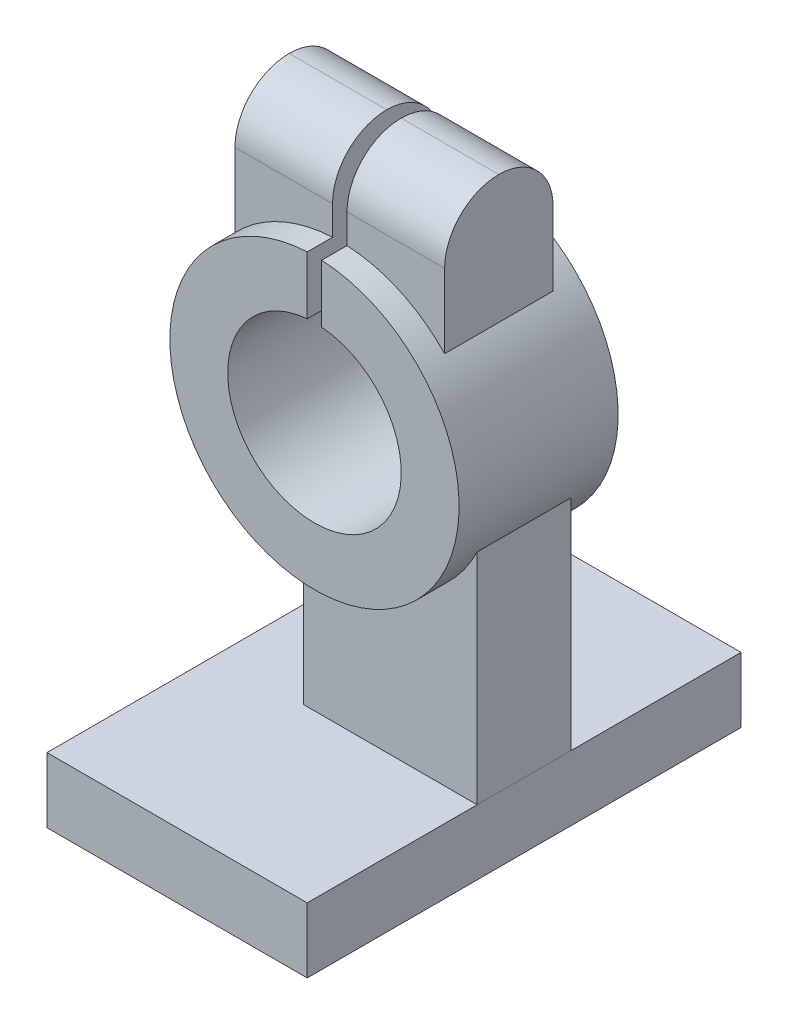
ISO-10303-21;
HEADER;
FILE_DESCRIPTION(('STEP AP214'),'2;1');
FILE_NAME('part.step','',(''),(''),'','','');
FILE_SCHEMA(('AUTOMOTIVE_DESIGN { 1 0 10303 214 1 1 1 1 }'));
ENDSEC;
DATA;
#1=APPLICATION_CONTEXT('core data for automotive mechanical design processes');
#2=APPLICATION_PROTOCOL_DEFINITION('international standard','automotive_design',2000,#1);
#3=PRODUCT_CONTEXT('',#1,'mechanical');
#4=PRODUCT('Part','Part','',(#3));
#5=PRODUCT_RELATED_PRODUCT_CATEGORY('part','',(#4));
#6=PRODUCT_DEFINITION_FORMATION('','',#4);
#7=PRODUCT_DEFINITION_CONTEXT('part definition',#1,'design');
#8=PRODUCT_DEFINITION('design','',#6,#7);
#9=PRODUCT_DEFINITION_SHAPE('','',#8);
#10=(LENGTH_UNIT() NAMED_UNIT(*) SI_UNIT(.MILLI.,.METRE.));
#11=(NAMED_UNIT(*) PLANE_ANGLE_UNIT() SI_UNIT($,.RADIAN.));
#12=(NAMED_UNIT(*) SI_UNIT($,.STERADIAN.) SOLID_ANGLE_UNIT());
#13=UNCERTAINTY_MEASURE_WITH_UNIT(LENGTH_MEASURE(1.E-05),#10,'distance_accuracy_value','');
#14=(GEOMETRIC_REPRESENTATION_CONTEXT(3) GLOBAL_UNCERTAINTY_ASSIGNED_CONTEXT((#13)) GLOBAL_UNIT_ASSIGNED_CONTEXT((#10,
#11,#12)) REPRESENTATION_CONTEXT('',''));
#15=CARTESIAN_POINT('',(0.,0.,0.));
#16=DIRECTION('',(0.,0.,1.));
#17=DIRECTION('',(1.,0.,0.));
#18=AXIS2_PLACEMENT_3D('',#15,#16,#17);
#19=CARTESIAN_POINT('',(0.,87.,22.));
#20=DIRECTION('',(0.,0.,-1.));
#21=DIRECTION('',(-1.,0.,0.));
#22=AXIS2_PLACEMENT_3D('',#19,#20,#21);
#23=CYLINDRICAL_SURFACE('',#22,40.);
#24=CARTESIAN_POINT('',(0.,87.,13.));
#25=DIRECTION('',(0.,0.,1.));
#26=DIRECTION('',(1.,0.,0.));
#27=AXIS2_PLACEMENT_3D('',#24,#25,#26);
#28=CIRCLE('',#27,40.);
#29=CARTESIAN_POINT('',(-12.,48.8424319433221,13.));
#30=VERTEX_POINT('',#29);
#31=CARTESIAN_POINT('',(36.,69.5644042258373,13.));
#32=VERTEX_POINT('',#31);
#33=EDGE_CURVE('E334',#30,#32,#28,.T.);
#34=ORIENTED_EDGE('',*,*,#33,.T.);
#35=DIRECTION('',(0.,0.,-1.));
#36=VECTOR('',#35,1.);
#37=CARTESIAN_POINT('',(36.,69.5644042258373,22.));
#38=LINE('',#37,#36);
#39=CARTESIAN_POINT('',(36.,69.5644042258372,-13.));
#40=VERTEX_POINT('',#39);
#41=EDGE_CURVE('E215',#32,#40,#38,.T.);
#42=ORIENTED_EDGE('',*,*,#41,.T.);
#43=CARTESIAN_POINT('',(0.,87.,-13.));
#44=DIRECTION('',(0.,0.,1.));
#45=DIRECTION('',(1.,0.,0.));
#46=AXIS2_PLACEMENT_3D('',#43,#44,#45);
#47=CIRCLE('',#46,40.);
#48=CARTESIAN_POINT('',(-12.,48.8424319433221,-13.));
#49=VERTEX_POINT('',#48);
#50=EDGE_CURVE('E332',#49,#40,#47,.T.);
#51=ORIENTED_EDGE('',*,*,#50,.F.);
#52=DIRECTION('',(0.,0.,-1.));
#53=VECTOR('',#52,1.);
#54=CARTESIAN_POINT('',(-12.,48.8424319433221,22.));
#55=LINE('',#54,#53);
#56=EDGE_CURVE('E208',#49,#30,#55,.F.);
#57=ORIENTED_EDGE('',*,*,#56,.T.);
#58=EDGE_LOOP('',(#34,#42,#51,#57));
#59=FACE_BOUND('',#58,.T.);
#60=DIRECTION('',(0.,0.,-1.));
#61=VECTOR('',#60,1.);
#62=CARTESIAN_POINT('',(-2.,126.949968710876,22.));
#63=LINE('',#62,#61);
#64=CARTESIAN_POINT('',(-2.,126.949968710876,-22.));
#65=VERTEX_POINT('',#64);
#66=CARTESIAN_POINT('',(-2.,126.949968710876,-15.));
#67=VERTEX_POINT('',#66);
#68=EDGE_CURVE('E425',#65,#67,#63,.F.);
#69=ORIENTED_EDGE('',*,*,#68,.F.);
#70=CARTESIAN_POINT('',(0.,87.,-22.));
#71=DIRECTION('',(0.,0.,1.));
#72=DIRECTION('',(1.,0.,0.));
#73=AXIS2_PLACEMENT_3D('',#70,#71,#72);
#74=CIRCLE('',#73,40.);
#75=CARTESIAN_POINT('',(2.,126.949968710876,-22.));
#76=VERTEX_POINT('',#75);
#77=EDGE_CURVE('E194',#65,#76,#74,.T.);
#78=ORIENTED_EDGE('',*,*,#77,.T.);
#79=DIRECTION('',(0.,0.,-1.));
#80=VECTOR('',#79,1.);
#81=CARTESIAN_POINT('',(2.,126.949968710876,22.));
#82=LINE('',#81,#80);
#83=CARTESIAN_POINT('',(2.,126.949968710876,-15.));
#84=VERTEX_POINT('',#83);
#85=EDGE_CURVE('E408',#76,#84,#82,.F.);
#86=ORIENTED_EDGE('',*,*,#85,.T.);
#87=CARTESIAN_POINT('',(0.,87.,-15.));
#88=DIRECTION('',(0.,0.,1.));
#89=DIRECTION('',(1.,0.,0.));
#90=AXIS2_PLACEMENT_3D('',#87,#88,#89);
#91=CIRCLE('',#90,40.);
#92=CARTESIAN_POINT('',(29.,114.549954627912,-15.));
#93=VERTEX_POINT('',#92);
#94=EDGE_CURVE('E297',#93,#84,#91,.T.);
#95=ORIENTED_EDGE('',*,*,#94,.F.);
#96=DIRECTION('',(0.,0.,-1.));
#97=VECTOR('',#96,1.);
#98=CARTESIAN_POINT('',(29.,114.549954627912,22.));
#99=LINE('',#98,#97);
#100=CARTESIAN_POINT('',(29.,114.549954627912,15.));
#101=VERTEX_POINT('',#100);
#102=EDGE_CURVE('E280',#93,#101,#99,.F.);
#103=ORIENTED_EDGE('',*,*,#102,.T.);
#104=CARTESIAN_POINT('',(0.,87.,15.));
#105=DIRECTION('',(0.,0.,1.));
#106=DIRECTION('',(1.,0.,0.));
#107=AXIS2_PLACEMENT_3D('',#104,#105,#106);
#108=CIRCLE('',#107,40.);
#109=CARTESIAN_POINT('',(2.,126.949968710876,15.));
#110=VERTEX_POINT('',#109);
#111=EDGE_CURVE('E278',#101,#110,#108,.T.);
#112=ORIENTED_EDGE('',*,*,#111,.T.);
#113=CARTESIAN_POINT('',(2.,126.949968710876,22.));
#114=VERTEX_POINT('',#113);
#115=EDGE_CURVE('E410',#110,#114,#82,.F.);
#116=ORIENTED_EDGE('',*,*,#115,.T.);
#117=CARTESIAN_POINT('',(0.,87.,22.));
#118=DIRECTION('',(0.,0.,1.));
#119=DIRECTION('',(1.,0.,0.));
#120=AXIS2_PLACEMENT_3D('',#117,#118,#119);
#121=CIRCLE('',#120,40.);
#122=CARTESIAN_POINT('',(-2.,126.949968710876,22.));
#123=VERTEX_POINT('',#122);
#124=EDGE_CURVE('E206',#123,#114,#121,.T.);
#125=ORIENTED_EDGE('',*,*,#124,.F.);
#126=CARTESIAN_POINT('',(-2.,126.949968710876,15.));
#127=VERTEX_POINT('',#126);
#128=EDGE_CURVE('E423',#127,#123,#63,.F.);
#129=ORIENTED_EDGE('',*,*,#128,.F.);
#130=CARTESIAN_POINT('',(-29.,114.549954627912,15.));
#131=VERTEX_POINT('',#130);
#132=EDGE_CURVE('E301',#127,#131,#108,.T.);
#133=ORIENTED_EDGE('',*,*,#132,.T.);
#134=DIRECTION('',(0.,0.,-1.));
#135=VECTOR('',#134,1.);
#136=CARTESIAN_POINT('',(-29.,114.549954627912,22.));
#137=LINE('',#136,#135);
#138=CARTESIAN_POINT('',(-29.,114.549954627912,-15.));
#139=VERTEX_POINT('',#138);
#140=EDGE_CURVE('E220',#131,#139,#137,.T.);
#141=ORIENTED_EDGE('',*,*,#140,.T.);
#142=EDGE_CURVE('E285',#67,#139,#91,.T.);
#143=ORIENTED_EDGE('',*,*,#142,.F.);
#144=EDGE_LOOP('',(#69,#78,#86,#95,#103,#112,#116,#125,#129,#133,#141,#143));
#145=FACE_BOUND('',#144,.T.);
#146=ADVANCED_FACE('F49',(#59,#145),#23,.T.);
#147=CARTESIAN_POINT('',(0.,87.,22.));
#148=DIRECTION('',(0.,0.,1.));
#149=DIRECTION('',(1.,0.,0.));
#150=AXIS2_PLACEMENT_3D('',#147,#148,#149);
#151=PLANE('',#150);
#152=CARTESIAN_POINT('',(0.,87.,22.));
#153=DIRECTION('',(0.,0.,1.));
#154=DIRECTION('',(1.,0.,0.));
#155=AXIS2_PLACEMENT_3D('',#152,#153,#154);
#156=CIRCLE('',#155,24.);
#157=CARTESIAN_POINT('',(-2.,110.916521486203,22.));
#158=VERTEX_POINT('',#157);
#159=CARTESIAN_POINT('',(2.,110.916521486203,22.));
#160=VERTEX_POINT('',#159);
#161=EDGE_CURVE('E202',#158,#160,#156,.T.);
#162=ORIENTED_EDGE('',*,*,#161,.F.);
#163=DIRECTION('',(0.,1.,0.));
#164=VECTOR('',#163,1.);
#165=CARTESIAN_POINT('',(-2.,110.916521486203,22.));
#166=LINE('',#165,#164);
#167=EDGE_CURVE('E178',#158,#123,#166,.T.);
#168=ORIENTED_EDGE('',*,*,#167,.T.);
#169=ORIENTED_EDGE('',*,*,#124,.T.);
#170=DIRECTION('',(0.,1.,0.));
#171=VECTOR('',#170,1.);
#172=CARTESIAN_POINT('',(2.,110.916521486203,22.));
#173=LINE('',#172,#171);
#174=EDGE_CURVE('E197',#160,#114,#173,.T.);
#175=ORIENTED_EDGE('',*,*,#174,.F.);
#176=EDGE_LOOP('',(#162,#168,#169,#175));
#177=FACE_BOUND('',#176,.T.);
#178=ADVANCED_FACE('F371',(#177),#151,.T.);
#179=CARTESIAN_POINT('',(0.,87.,-22.));
#180=DIRECTION('',(0.,0.,1.));
#181=DIRECTION('',(1.,0.,0.));
#182=AXIS2_PLACEMENT_3D('',#179,#180,#181);
#183=PLANE('',#182);
#184=DIRECTION('',(0.,1.,0.));
#185=VECTOR('',#184,1.);
#186=CARTESIAN_POINT('',(-2.,110.916521486203,-22.));
#187=LINE('',#186,#185);
#188=CARTESIAN_POINT('',(-2.,110.916521486203,-22.));
#189=VERTEX_POINT('',#188);
#190=EDGE_CURVE('E175',#189,#65,#187,.T.);
#191=ORIENTED_EDGE('',*,*,#190,.F.);
#192=CARTESIAN_POINT('',(0.,87.,-22.));
#193=DIRECTION('',(0.,0.,1.));
#194=DIRECTION('',(1.,0.,0.));
#195=AXIS2_PLACEMENT_3D('',#192,#193,#194);
#196=CIRCLE('',#195,24.);
#197=CARTESIAN_POINT('',(2.,110.916521486203,-22.));
#198=VERTEX_POINT('',#197);
#199=EDGE_CURVE('E192',#189,#198,#196,.T.);
#200=ORIENTED_EDGE('',*,*,#199,.T.);
#201=DIRECTION('',(0.,1.,0.));
#202=VECTOR('',#201,1.);
#203=CARTESIAN_POINT('',(2.,110.916521486203,-22.));
#204=LINE('',#203,#202);
#205=EDGE_CURVE('E196',#198,#76,#204,.T.);
#206=ORIENTED_EDGE('',*,*,#205,.T.);
#207=ORIENTED_EDGE('',*,*,#77,.F.);
#208=EDGE_LOOP('',(#191,#200,#206,#207));
#209=FACE_BOUND('',#208,.T.);
#210=ADVANCED_FACE('F190',(#209),#183,.F.);
#211=CARTESIAN_POINT('',(0.,87.,-22.));
#212=DIRECTION('',(0.,0.,1.));
#213=DIRECTION('',(1.,0.,0.));
#214=AXIS2_PLACEMENT_3D('',#211,#212,#213);
#215=CYLINDRICAL_SURFACE('',#214,24.);
#216=DIRECTION('',(0.,0.,1.));
#217=VECTOR('',#216,1.);
#218=CARTESIAN_POINT('',(-2.,110.916521486203,-22.));
#219=LINE('',#218,#217);
#220=EDGE_CURVE('E172',#189,#158,#219,.T.);
#221=ORIENTED_EDGE('',*,*,#220,.T.);
#222=ORIENTED_EDGE('',*,*,#161,.T.);
#223=DIRECTION('',(0.,0.,1.));
#224=VECTOR('',#223,1.);
#225=CARTESIAN_POINT('',(2.,110.916521486203,-22.));
#226=LINE('',#225,#224);
#227=EDGE_CURVE('E185',#198,#160,#226,.T.);
#228=ORIENTED_EDGE('',*,*,#227,.F.);
#229=ORIENTED_EDGE('',*,*,#199,.F.);
#230=EDGE_LOOP('',(#221,#222,#228,#229));
#231=FACE_BOUND('',#230,.T.);
#232=ADVANCED_FACE('F200',(#231),#215,.F.);
#233=CARTESIAN_POINT('',(0.,79.5,15.));
#234=DIRECTION('',(0.,0.,1.));
#235=DIRECTION('',(1.,0.,0.));
#236=AXIS2_PLACEMENT_3D('',#233,#234,#235);
#237=PLANE('',#236);
#238=ORIENTED_EDGE('',*,*,#132,.F.);
#239=DIRECTION('',(0.,1.,0.));
#240=VECTOR('',#239,1.);
#241=CARTESIAN_POINT('',(-2.,79.5,15.));
#242=LINE('',#241,#240);
#243=CARTESIAN_POINT('',(-2.,135.,15.));
#244=VERTEX_POINT('',#243);
#245=EDGE_CURVE('E421',#127,#244,#242,.T.);
#246=ORIENTED_EDGE('',*,*,#245,.T.);
#247=DIRECTION('',(-1.,0.,0.));
#248=VECTOR('',#247,1.);
#249=CARTESIAN_POINT('',(0.,135.,15.));
#250=LINE('',#249,#248);
#251=CARTESIAN_POINT('',(-29.,135.,15.));
#252=VERTEX_POINT('',#251);
#253=EDGE_CURVE('E224',#244,#252,#250,.T.);
#254=ORIENTED_EDGE('',*,*,#253,.T.);
#255=DIRECTION('',(0.,1.,0.));
#256=VECTOR('',#255,1.);
#257=CARTESIAN_POINT('',(-29.,79.5,15.));
#258=LINE('',#257,#256);
#259=EDGE_CURVE('E281',#252,#131,#258,.F.);
#260=ORIENTED_EDGE('',*,*,#259,.T.);
#261=EDGE_LOOP('',(#238,#246,#254,#260));
#262=FACE_BOUND('',#261,.T.);
#263=ADVANCED_FACE('F440',(#262),#237,.T.);
#264=CARTESIAN_POINT('',(0.,79.5,-15.));
#265=DIRECTION('',(0.,0.,1.));
#266=DIRECTION('',(1.,0.,0.));
#267=AXIS2_PLACEMENT_3D('',#264,#265,#266);
#268=PLANE('',#267);
#269=DIRECTION('',(0.,1.,0.));
#270=VECTOR('',#269,1.);
#271=CARTESIAN_POINT('',(-2.,79.5,-15.));
#272=LINE('',#271,#270);
#273=CARTESIAN_POINT('',(-2.,135.,-15.));
#274=VERTEX_POINT('',#273);
#275=EDGE_CURVE('E414',#67,#274,#272,.T.);
#276=ORIENTED_EDGE('',*,*,#275,.F.);
#277=ORIENTED_EDGE('',*,*,#142,.T.);
#278=DIRECTION('',(0.,1.,0.));
#279=VECTOR('',#278,1.);
#280=CARTESIAN_POINT('',(-29.,79.5,-15.));
#281=LINE('',#280,#279);
#282=CARTESIAN_POINT('',(-29.,135.,-15.));
#283=VERTEX_POINT('',#282);
#284=EDGE_CURVE('E250',#283,#139,#281,.F.);
#285=ORIENTED_EDGE('',*,*,#284,.F.);
#286=DIRECTION('',(-1.,0.,0.));
#287=VECTOR('',#286,1.);
#288=CARTESIAN_POINT('',(29.,135.,-15.));
#289=LINE('',#288,#287);
#290=EDGE_CURVE('E243',#283,#274,#289,.F.);
#291=ORIENTED_EDGE('',*,*,#290,.T.);
#292=EDGE_LOOP('',(#276,#277,#285,#291));
#293=FACE_BOUND('',#292,.T.);
#294=ADVANCED_FACE('F393',(#293),#268,.F.);
#295=CARTESIAN_POINT('',(-29.,135.,0.));
#296=DIRECTION('',(1.,0.,0.));
#297=DIRECTION('',(0.,0.,-1.));
#298=AXIS2_PLACEMENT_3D('',#295,#296,#297);
#299=CYLINDRICAL_SURFACE('',#298,15.);
#300=DIRECTION('',(-1.,0.,0.));
#301=VECTOR('',#300,1.);
#302=CARTESIAN_POINT('',(-29.,150.,0.));
#303=LINE('',#302,#301);
#304=CARTESIAN_POINT('',(-2.,150.,0.));
#305=VERTEX_POINT('',#304);
#306=CARTESIAN_POINT('',(-29.,150.,0.));
#307=VERTEX_POINT('',#306);
#308=EDGE_CURVE('E251',#305,#307,#303,.T.);
#309=ORIENTED_EDGE('',*,*,#308,.F.);
#310=CARTESIAN_POINT('',(-2.,135.,0.));
#311=DIRECTION('',(1.,0.,0.));
#312=DIRECTION('',(0.,1.,0.));
#313=AXIS2_PLACEMENT_3D('',#310,#311,#312);
#314=CIRCLE('',#313,15.);
#315=EDGE_CURVE('E73',#305,#274,#314,.F.);
#316=ORIENTED_EDGE('',*,*,#315,.T.);
#317=ORIENTED_EDGE('',*,*,#290,.F.);
#318=CARTESIAN_POINT('',(-29.,135.,0.));
#319=DIRECTION('',(-1.,0.,0.));
#320=DIRECTION('',(0.,0.,1.));
#321=AXIS2_PLACEMENT_3D('',#318,#319,#320);
#322=CIRCLE('',#321,15.);
#323=EDGE_CURVE('E229',#307,#283,#322,.T.);
#324=ORIENTED_EDGE('',*,*,#323,.F.);
#325=EDGE_LOOP('',(#309,#316,#317,#324));
#326=FACE_BOUND('',#325,.T.);
#327=ADVANCED_FACE('F386',(#326),#299,.T.);
#328=CARTESIAN_POINT('',(0.,135.,0.));
#329=DIRECTION('',(-1.,0.,0.));
#330=DIRECTION('',(0.,0.,1.));
#331=AXIS2_PLACEMENT_3D('',#328,#329,#330);
#332=CYLINDRICAL_SURFACE('',#331,15.);
#333=ORIENTED_EDGE('',*,*,#253,.F.);
#334=CARTESIAN_POINT('',(-2.,135.,0.));
#335=DIRECTION('',(1.,0.,0.));
#336=DIRECTION('',(0.,1.,0.));
#337=AXIS2_PLACEMENT_3D('',#334,#335,#336);
#338=CIRCLE('',#337,15.);
#339=EDGE_CURVE('E12',#244,#305,#338,.F.);
#340=ORIENTED_EDGE('',*,*,#339,.T.);
#341=ORIENTED_EDGE('',*,*,#308,.T.);
#342=CARTESIAN_POINT('',(-29.,135.,0.));
#343=DIRECTION('',(-1.,0.,0.));
#344=DIRECTION('',(0.,0.,1.));
#345=AXIS2_PLACEMENT_3D('',#342,#343,#344);
#346=CIRCLE('',#345,15.);
#347=EDGE_CURVE('E232',#252,#307,#346,.T.);
#348=ORIENTED_EDGE('',*,*,#347,.F.);
#349=EDGE_LOOP('',(#333,#340,#341,#348));
#350=FACE_BOUND('',#349,.T.);
#351=ADVANCED_FACE('F380',(#350),#332,.T.);
#352=CARTESIAN_POINT('',(36.,9.,0.));
#353=DIRECTION('',(-1.,0.,0.));
#354=DIRECTION('',(0.,-1.,0.));
#355=AXIS2_PLACEMENT_3D('',#352,#353,#354);
#356=PLANE('',#355);
#357=ORIENTED_EDGE('',*,*,#41,.F.);
#358=DIRECTION('',(0.,1.,0.));
#359=VECTOR('',#358,1.);
#360=CARTESIAN_POINT('',(36.,73.8363213704825,13.));
#361=LINE('',#360,#359);
#362=CARTESIAN_POINT('',(36.,8.99999999999999,13.));
#363=VERTEX_POINT('',#362);
#364=EDGE_CURVE('E305',#32,#363,#361,.F.);
#365=ORIENTED_EDGE('',*,*,#364,.T.);
#366=DIRECTION('',(0.,0.,1.));
#367=VECTOR('',#366,1.);
#368=CARTESIAN_POINT('',(36.,9.,0.));
#369=LINE('',#368,#367);
#370=CARTESIAN_POINT('',(36.,8.99999999999999,-13.));
#371=VERTEX_POINT('',#370);
#372=EDGE_CURVE('E308',#371,#363,#369,.T.);
#373=ORIENTED_EDGE('',*,*,#372,.F.);
#374=DIRECTION('',(0.,1.,0.));
#375=VECTOR('',#374,1.);
#376=CARTESIAN_POINT('',(36.,73.8363213704825,-13.));
#377=LINE('',#376,#375);
#378=EDGE_CURVE('E316',#40,#371,#377,.F.);
#379=ORIENTED_EDGE('',*,*,#378,.F.);
#380=EDGE_LOOP('',(#357,#365,#373,#379));
#381=FACE_BOUND('',#380,.T.);
#382=ADVANCED_FACE('F357',(#381),#356,.F.);
#383=CARTESIAN_POINT('',(-12.,9.,0.));
#384=DIRECTION('',(1.,0.,0.));
#385=DIRECTION('',(0.,1.,0.));
#386=AXIS2_PLACEMENT_3D('',#383,#384,#385);
#387=PLANE('',#386);
#388=ORIENTED_EDGE('',*,*,#56,.F.);
#389=DIRECTION('',(0.,1.,0.));
#390=VECTOR('',#389,1.);
#391=CARTESIAN_POINT('',(-12.,73.8363213704825,-13.));
#392=LINE('',#391,#390);
#393=CARTESIAN_POINT('',(-12.,8.99999999999999,-13.));
#394=VERTEX_POINT('',#393);
#395=EDGE_CURVE('E304',#394,#49,#392,.T.);
#396=ORIENTED_EDGE('',*,*,#395,.F.);
#397=DIRECTION('',(0.,0.,1.));
#398=VECTOR('',#397,1.);
#399=CARTESIAN_POINT('',(-12.,9.,0.));
#400=LINE('',#399,#398);
#401=CARTESIAN_POINT('',(-12.,8.99999999999999,13.));
#402=VERTEX_POINT('',#401);
#403=EDGE_CURVE('E328',#394,#402,#400,.T.);
#404=ORIENTED_EDGE('',*,*,#403,.T.);
#405=DIRECTION('',(0.,1.,0.));
#406=VECTOR('',#405,1.);
#407=CARTESIAN_POINT('',(-12.,73.8363213704825,13.));
#408=LINE('',#407,#406);
#409=EDGE_CURVE('E312',#402,#30,#408,.T.);
#410=ORIENTED_EDGE('',*,*,#409,.T.);
#411=EDGE_LOOP('',(#388,#396,#404,#410));
#412=FACE_BOUND('',#411,.T.);
#413=ADVANCED_FACE('F349',(#412),#387,.F.);
#414=CARTESIAN_POINT('',(3.31038209114373,73.8363213704825,13.));
#415=DIRECTION('',(0.,0.,1.));
#416=DIRECTION('',(1.,0.,0.));
#417=AXIS2_PLACEMENT_3D('',#414,#415,#416);
#418=PLANE('',#417);
#419=ORIENTED_EDGE('',*,*,#364,.F.);
#420=ORIENTED_EDGE('',*,*,#33,.F.);
#421=ORIENTED_EDGE('',*,*,#409,.F.);
#422=DIRECTION('',(1.,0.,0.));
#423=VECTOR('',#422,1.);
#424=CARTESIAN_POINT('',(3.31038209114373,8.99999999999999,13.));
#425=LINE('',#424,#423);
#426=EDGE_CURVE('E309',#363,#402,#425,.F.);
#427=ORIENTED_EDGE('',*,*,#426,.F.);
#428=EDGE_LOOP('',(#419,#420,#421,#427));
#429=FACE_BOUND('',#428,.T.);
#430=ADVANCED_FACE('F347',(#429),#418,.T.);
#431=CARTESIAN_POINT('',(3.31038209114373,73.8363213704825,-13.));
#432=DIRECTION('',(0.,0.,1.));
#433=DIRECTION('',(1.,0.,0.));
#434=AXIS2_PLACEMENT_3D('',#431,#432,#433);
#435=PLANE('',#434);
#436=DIRECTION('',(1.,0.,0.));
#437=VECTOR('',#436,1.);
#438=CARTESIAN_POINT('',(3.31038209114373,8.99999999999999,-13.));
#439=LINE('',#438,#437);
#440=EDGE_CURVE('E319',#371,#394,#439,.F.);
#441=ORIENTED_EDGE('',*,*,#440,.T.);
#442=ORIENTED_EDGE('',*,*,#395,.T.);
#443=ORIENTED_EDGE('',*,*,#50,.T.);
#444=ORIENTED_EDGE('',*,*,#378,.T.);
#445=EDGE_LOOP('',(#441,#442,#443,#444));
#446=FACE_BOUND('',#445,.T.);
#447=ADVANCED_FACE('F359',(#446),#435,.F.);
#448=CARTESIAN_POINT('',(-12.,9.,0.));
#449=DIRECTION('',(0.,1.,0.));
#450=DIRECTION('',(-1.,0.,0.));
#451=AXIS2_PLACEMENT_3D('',#448,#449,#450);
#452=PLANE('',#451);
#453=ORIENTED_EDGE('',*,*,#426,.T.);
#454=ORIENTED_EDGE('',*,*,#403,.F.);
#455=ORIENTED_EDGE('',*,*,#440,.F.);
#456=ORIENTED_EDGE('',*,*,#372,.T.);
#457=EDGE_LOOP('',(#453,#454,#455,#456));
#458=FACE_BOUND('',#457,.T.);
#459=ADVANCED_FACE('F353',(#458),#452,.F.);
#460=CARTESIAN_POINT('',(-29.,150.,0.));
#461=DIRECTION('',(-1.,0.,0.));
#462=DIRECTION('',(0.,-1.,0.));
#463=AXIS2_PLACEMENT_3D('',#460,#461,#462);
#464=PLANE('',#463);
#465=ORIENTED_EDGE('',*,*,#259,.F.);
#466=ORIENTED_EDGE('',*,*,#347,.T.);
#467=ORIENTED_EDGE('',*,*,#323,.T.);
#468=ORIENTED_EDGE('',*,*,#284,.T.);
#469=ORIENTED_EDGE('',*,*,#140,.F.);
#470=EDGE_LOOP('',(#465,#466,#467,#468,#469));
#471=FACE_BOUND('',#470,.T.);
#472=ADVANCED_FACE('F366',(#471),#464,.T.);
#473=DIRECTION('',(0.,1.,0.));
#474=VECTOR('',#473,1.);
#475=CARTESIAN_POINT('',(2.,79.5,15.));
#476=LINE('',#475,#474);
#477=CARTESIAN_POINT('',(2.,135.,15.));
#478=VERTEX_POINT('',#477);
#479=EDGE_CURVE('E65',#110,#478,#476,.T.);
#480=ORIENTED_EDGE('',*,*,#479,.F.);
#481=ORIENTED_EDGE('',*,*,#111,.F.);
#482=DIRECTION('',(0.,1.,0.));
#483=VECTOR('',#482,1.);
#484=CARTESIAN_POINT('',(29.,79.5,15.));
#485=LINE('',#484,#483);
#486=CARTESIAN_POINT('',(29.,135.,15.));
#487=VERTEX_POINT('',#486);
#488=EDGE_CURVE('E272',#101,#487,#485,.T.);
#489=ORIENTED_EDGE('',*,*,#488,.T.);
#490=EDGE_CURVE('E225',#487,#478,#250,.T.);
#491=ORIENTED_EDGE('',*,*,#490,.T.);
#492=EDGE_LOOP('',(#480,#481,#489,#491));
#493=FACE_BOUND('',#492,.T.);
#494=ADVANCED_FACE('F276',(#493),#237,.T.);
#495=ORIENTED_EDGE('',*,*,#94,.T.);
#496=DIRECTION('',(0.,1.,0.));
#497=VECTOR('',#496,1.);
#498=CARTESIAN_POINT('',(2.,79.5,-15.));
#499=LINE('',#498,#497);
#500=CARTESIAN_POINT('',(2.,135.,-15.));
#501=VERTEX_POINT('',#500);
#502=EDGE_CURVE('E264',#84,#501,#499,.T.);
#503=ORIENTED_EDGE('',*,*,#502,.T.);
#504=CARTESIAN_POINT('',(29.,135.,-15.));
#505=VERTEX_POINT('',#504);
#506=EDGE_CURVE('E242',#501,#505,#289,.F.);
#507=ORIENTED_EDGE('',*,*,#506,.T.);
#508=DIRECTION('',(0.,1.,0.));
#509=VECTOR('',#508,1.);
#510=CARTESIAN_POINT('',(29.,79.5,-15.));
#511=LINE('',#510,#509);
#512=EDGE_CURVE('E288',#93,#505,#511,.T.);
#513=ORIENTED_EDGE('',*,*,#512,.F.);
#514=EDGE_LOOP('',(#495,#503,#507,#513));
#515=FACE_BOUND('',#514,.T.);
#516=ADVANCED_FACE('F405',(#515),#268,.F.);
#517=CARTESIAN_POINT('',(29.,150.,0.));
#518=DIRECTION('',(1.,0.,0.));
#519=DIRECTION('',(0.,1.,0.));
#520=AXIS2_PLACEMENT_3D('',#517,#518,#519);
#521=PLANE('',#520);
#522=CARTESIAN_POINT('',(29.,135.,0.));
#523=DIRECTION('',(1.,0.,0.));
#524=DIRECTION('',(0.,0.,-1.));
#525=AXIS2_PLACEMENT_3D('',#522,#523,#524);
#526=CIRCLE('',#525,15.);
#527=CARTESIAN_POINT('',(29.,150.,0.));
#528=VERTEX_POINT('',#527);
#529=EDGE_CURVE('E236',#505,#528,#526,.T.);
#530=ORIENTED_EDGE('',*,*,#529,.T.);
#531=CARTESIAN_POINT('',(29.,135.,0.));
#532=DIRECTION('',(1.,0.,0.));
#533=DIRECTION('',(0.,0.,-1.));
#534=AXIS2_PLACEMENT_3D('',#531,#532,#533);
#535=CIRCLE('',#534,15.);
#536=EDGE_CURVE('E239',#528,#487,#535,.T.);
#537=ORIENTED_EDGE('',*,*,#536,.T.);
#538=ORIENTED_EDGE('',*,*,#488,.F.);
#539=ORIENTED_EDGE('',*,*,#102,.F.);
#540=ORIENTED_EDGE('',*,*,#512,.T.);
#541=EDGE_LOOP('',(#530,#537,#538,#539,#540));
#542=FACE_BOUND('',#541,.T.);
#543=ADVANCED_FACE('F270',(#542),#521,.T.);
#544=CARTESIAN_POINT('',(2.,135.,0.));
#545=DIRECTION('',(1.,0.,0.));
#546=DIRECTION('',(0.,1.,0.));
#547=AXIS2_PLACEMENT_3D('',#544,#545,#546);
#548=CIRCLE('',#547,15.);
#549=CARTESIAN_POINT('',(2.,150.,0.));
#550=VERTEX_POINT('',#549);
#551=EDGE_CURVE('E184',#550,#501,#548,.F.);
#552=ORIENTED_EDGE('',*,*,#551,.F.);
#553=EDGE_CURVE('E247',#528,#550,#303,.T.);
#554=ORIENTED_EDGE('',*,*,#553,.F.);
#555=ORIENTED_EDGE('',*,*,#529,.F.);
#556=ORIENTED_EDGE('',*,*,#506,.F.);
#557=EDGE_LOOP('',(#552,#554,#555,#556));
#558=FACE_BOUND('',#557,.T.);
#559=ADVANCED_FACE('F51',(#558),#299,.T.);
#560=CARTESIAN_POINT('',(2.,135.,0.));
#561=DIRECTION('',(1.,0.,0.));
#562=DIRECTION('',(0.,1.,0.));
#563=AXIS2_PLACEMENT_3D('',#560,#561,#562);
#564=CIRCLE('',#563,15.);
#565=EDGE_CURVE('E58',#478,#550,#564,.F.);
#566=ORIENTED_EDGE('',*,*,#565,.F.);
#567=ORIENTED_EDGE('',*,*,#490,.F.);
#568=ORIENTED_EDGE('',*,*,#536,.F.);
#569=ORIENTED_EDGE('',*,*,#553,.T.);
#570=EDGE_LOOP('',(#566,#567,#568,#569));
#571=FACE_BOUND('',#570,.T.);
#572=ADVANCED_FACE('F266',(#571),#332,.T.);
#573=CARTESIAN_POINT('',(2.,110.916521486203,-22.));
#574=DIRECTION('',(1.,0.,0.));
#575=DIRECTION('',(0.,1.,0.));
#576=AXIS2_PLACEMENT_3D('',#573,#574,#575);
#577=PLANE('',#576);
#578=ORIENTED_EDGE('',*,*,#205,.F.);
#579=ORIENTED_EDGE('',*,*,#227,.T.);
#580=ORIENTED_EDGE('',*,*,#174,.T.);
#581=ORIENTED_EDGE('',*,*,#115,.F.);
#582=ORIENTED_EDGE('',*,*,#479,.T.);
#583=ORIENTED_EDGE('',*,*,#565,.T.);
#584=ORIENTED_EDGE('',*,*,#551,.T.);
#585=ORIENTED_EDGE('',*,*,#502,.F.);
#586=ORIENTED_EDGE('',*,*,#85,.F.);
#587=EDGE_LOOP('',(#578,#579,#580,#581,#582,#583,#584,#585,#586));
#588=FACE_BOUND('',#587,.T.);
#589=ADVANCED_FACE('F254',(#588),#577,.F.);
#590=CARTESIAN_POINT('',(-2.,110.916521486203,-22.));
#591=DIRECTION('',(1.,0.,0.));
#592=DIRECTION('',(0.,1.,0.));
#593=AXIS2_PLACEMENT_3D('',#590,#591,#592);
#594=PLANE('',#593);
#595=ORIENTED_EDGE('',*,*,#68,.T.);
#596=ORIENTED_EDGE('',*,*,#275,.T.);
#597=ORIENTED_EDGE('',*,*,#315,.F.);
#598=ORIENTED_EDGE('',*,*,#339,.F.);
#599=ORIENTED_EDGE('',*,*,#245,.F.);
#600=ORIENTED_EDGE('',*,*,#128,.T.);
#601=ORIENTED_EDGE('',*,*,#167,.F.);
#602=ORIENTED_EDGE('',*,*,#220,.F.);
#603=ORIENTED_EDGE('',*,*,#190,.T.);
#604=EDGE_LOOP('',(#595,#596,#597,#598,#599,#600,#601,#602,#603));
#605=FACE_BOUND('',#604,.T.);
#606=ADVANCED_FACE('F174',(#605),#594,.T.);
#607=CLOSED_SHELL('',(#146,#178,#210,#232,#263,#294,#327,#351,#382,#413,#430,#447,#459,#472,
#494,#516,#543,#559,#572,#589,#606));
#608=MANIFOLD_SOLID_BREP('B2',#607);
#609=CARTESIAN_POINT('',(36.,-9.,60.));
#610=DIRECTION('',(-1.,0.,0.));
#611=DIRECTION('',(0.,0.,1.));
#612=AXIS2_PLACEMENT_3D('',#609,#610,#611);
#613=PLANE('',#612);
#614=DIRECTION('',(0.,1.,0.));
#615=VECTOR('',#614,1.);
#616=CARTESIAN_POINT('',(36.,-9.,-60.));
#617=LINE('',#616,#615);
#618=CARTESIAN_POINT('',(36.,-9.,-60.));
#619=VERTEX_POINT('',#618);
#620=CARTESIAN_POINT('',(36.,9.,-60.));
#621=VERTEX_POINT('',#620);
#622=EDGE_CURVE('E654',#619,#621,#617,.T.);
#623=ORIENTED_EDGE('',*,*,#622,.T.);
#624=DIRECTION('',(0.,0.,-1.));
#625=VECTOR('',#624,1.);
#626=CARTESIAN_POINT('',(36.,9.,60.));
#627=LINE('',#626,#625);
#628=CARTESIAN_POINT('',(36.,9.,60.));
#629=VERTEX_POINT('',#628);
#630=EDGE_CURVE('E47',#629,#621,#627,.T.);
#631=ORIENTED_EDGE('',*,*,#630,.F.);
#632=DIRECTION('',(0.,1.,0.));
#633=VECTOR('',#632,1.);
#634=CARTESIAN_POINT('',(36.,-9.,60.));
#635=LINE('',#634,#633);
#636=CARTESIAN_POINT('',(36.,-9.,60.));
#637=VERTEX_POINT('',#636);
#638=EDGE_CURVE('E642',#637,#629,#635,.T.);
#639=ORIENTED_EDGE('',*,*,#638,.F.);
#640=DIRECTION('',(0.,0.,-1.));
#641=VECTOR('',#640,1.);
#642=CARTESIAN_POINT('',(36.,-9.,60.));
#643=LINE('',#642,#641);
#644=EDGE_CURVE('E650',#637,#619,#643,.T.);
#645=ORIENTED_EDGE('',*,*,#644,.T.);
#646=EDGE_LOOP('',(#623,#631,#639,#645));
#647=FACE_BOUND('',#646,.T.);
#648=ADVANCED_FACE('F591',(#647),#613,.F.);
#649=CARTESIAN_POINT('',(-36.,9.,60.));
#650=DIRECTION('',(0.,-1.,0.));
#651=DIRECTION('',(0.,0.,-1.));
#652=AXIS2_PLACEMENT_3D('',#649,#650,#651);
#653=PLANE('',#652);
#654=DIRECTION('',(-1.,0.,0.));
#655=VECTOR('',#654,1.);
#656=CARTESIAN_POINT('',(-36.,9.,-60.));
#657=LINE('',#656,#655);
#658=CARTESIAN_POINT('',(-36.,9.,-60.));
#659=VERTEX_POINT('',#658);
#660=EDGE_CURVE('E646',#621,#659,#657,.T.);
#661=ORIENTED_EDGE('',*,*,#660,.T.);
#662=DIRECTION('',(0.,0.,-1.));
#663=VECTOR('',#662,1.);
#664=CARTESIAN_POINT('',(-36.,9.,60.));
#665=LINE('',#664,#663);
#666=CARTESIAN_POINT('',(-36.,9.,60.));
#667=VERTEX_POINT('',#666);
#668=EDGE_CURVE('E599',#667,#659,#665,.T.);
#669=ORIENTED_EDGE('',*,*,#668,.F.);
#670=DIRECTION('',(-1.,0.,0.));
#671=VECTOR('',#670,1.);
#672=CARTESIAN_POINT('',(-36.,9.,60.));
#673=LINE('',#672,#671);
#674=EDGE_CURVE('E637',#629,#667,#673,.T.);
#675=ORIENTED_EDGE('',*,*,#674,.F.);
#676=ORIENTED_EDGE('',*,*,#630,.T.);
#677=EDGE_LOOP('',(#661,#669,#675,#676));
#678=FACE_BOUND('',#677,.T.);
#679=ADVANCED_FACE('F645',(#678),#653,.F.);
#680=CARTESIAN_POINT('',(-36.,-9.,60.));
#681=DIRECTION('',(1.,0.,0.));
#682=DIRECTION('',(0.,0.,-1.));
#683=AXIS2_PLACEMENT_3D('',#680,#681,#682);
#684=PLANE('',#683);
#685=DIRECTION('',(0.,-1.,0.));
#686=VECTOR('',#685,1.);
#687=CARTESIAN_POINT('',(-36.,-9.,-60.));
#688=LINE('',#687,#686);
#689=CARTESIAN_POINT('',(-36.,-9.,-60.));
#690=VERTEX_POINT('',#689);
#691=EDGE_CURVE('E624',#659,#690,#688,.T.);
#692=ORIENTED_EDGE('',*,*,#691,.T.);
#693=DIRECTION('',(0.,0.,-1.));
#694=VECTOR('',#693,1.);
#695=CARTESIAN_POINT('',(-36.,-9.,60.));
#696=LINE('',#695,#694);
#697=CARTESIAN_POINT('',(-36.,-9.,60.));
#698=VERTEX_POINT('',#697);
#699=EDGE_CURVE('E647',#698,#690,#696,.T.);
#700=ORIENTED_EDGE('',*,*,#699,.F.);
#701=DIRECTION('',(0.,-1.,0.));
#702=VECTOR('',#701,1.);
#703=CARTESIAN_POINT('',(-36.,-9.,60.));
#704=LINE('',#703,#702);
#705=EDGE_CURVE('E640',#667,#698,#704,.T.);
#706=ORIENTED_EDGE('',*,*,#705,.F.);
#707=ORIENTED_EDGE('',*,*,#668,.T.);
#708=EDGE_LOOP('',(#692,#700,#706,#707));
#709=FACE_BOUND('',#708,.T.);
#710=ADVANCED_FACE('F648',(#709),#684,.F.);
#711=CARTESIAN_POINT('',(-36.,-9.,60.));
#712=DIRECTION('',(0.,1.,0.));
#713=DIRECTION('',(0.,0.,1.));
#714=AXIS2_PLACEMENT_3D('',#711,#712,#713);
#715=PLANE('',#714);
#716=DIRECTION('',(1.,0.,0.));
#717=VECTOR('',#716,1.);
#718=CARTESIAN_POINT('',(-36.,-9.,-60.));
#719=LINE('',#718,#717);
#720=EDGE_CURVE('E630',#690,#619,#719,.T.);
#721=ORIENTED_EDGE('',*,*,#720,.T.);
#722=ORIENTED_EDGE('',*,*,#644,.F.);
#723=DIRECTION('',(1.,0.,0.));
#724=VECTOR('',#723,1.);
#725=CARTESIAN_POINT('',(-36.,-9.,60.));
#726=LINE('',#725,#724);
#727=EDGE_CURVE('E607',#698,#637,#726,.T.);
#728=ORIENTED_EDGE('',*,*,#727,.F.);
#729=ORIENTED_EDGE('',*,*,#699,.T.);
#730=EDGE_LOOP('',(#721,#722,#728,#729));
#731=FACE_BOUND('',#730,.T.);
#732=ADVANCED_FACE('F661',(#731),#715,.F.);
#733=CARTESIAN_POINT('',(0.,0.,60.));
#734=DIRECTION('',(0.,0.,-1.));
#735=DIRECTION('',(-1.,0.,0.));
#736=AXIS2_PLACEMENT_3D('',#733,#734,#735);
#737=PLANE('',#736);
#738=ORIENTED_EDGE('',*,*,#638,.T.);
#739=ORIENTED_EDGE('',*,*,#674,.T.);
#740=ORIENTED_EDGE('',*,*,#705,.T.);
#741=ORIENTED_EDGE('',*,*,#727,.T.);
#742=EDGE_LOOP('',(#738,#739,#740,#741));
#743=FACE_BOUND('',#742,.T.);
#744=ADVANCED_FACE('F638',(#743),#737,.F.);
#745=CARTESIAN_POINT('',(0.,0.,-60.));
#746=DIRECTION('',(0.,0.,-1.));
#747=DIRECTION('',(-1.,0.,0.));
#748=AXIS2_PLACEMENT_3D('',#745,#746,#747);
#749=PLANE('',#748);
#750=ORIENTED_EDGE('',*,*,#622,.F.);
#751=ORIENTED_EDGE('',*,*,#720,.F.);
#752=ORIENTED_EDGE('',*,*,#691,.F.);
#753=ORIENTED_EDGE('',*,*,#660,.F.);
#754=EDGE_LOOP('',(#750,#751,#752,#753));
#755=FACE_BOUND('',#754,.T.);
#756=ADVANCED_FACE('F664',(#755),#749,.T.);
#757=CLOSED_SHELL('',(#648,#679,#710,#732,#744,#756));
#758=MANIFOLD_SOLID_BREP('B6',#757);
#759=ADVANCED_BREP_SHAPE_REPRESENTATION('',(#18,#608,#758),#14);
#760=SHAPE_DEFINITION_REPRESENTATION(#9,#759);
ENDSEC;
END-ISO-10303-21;
